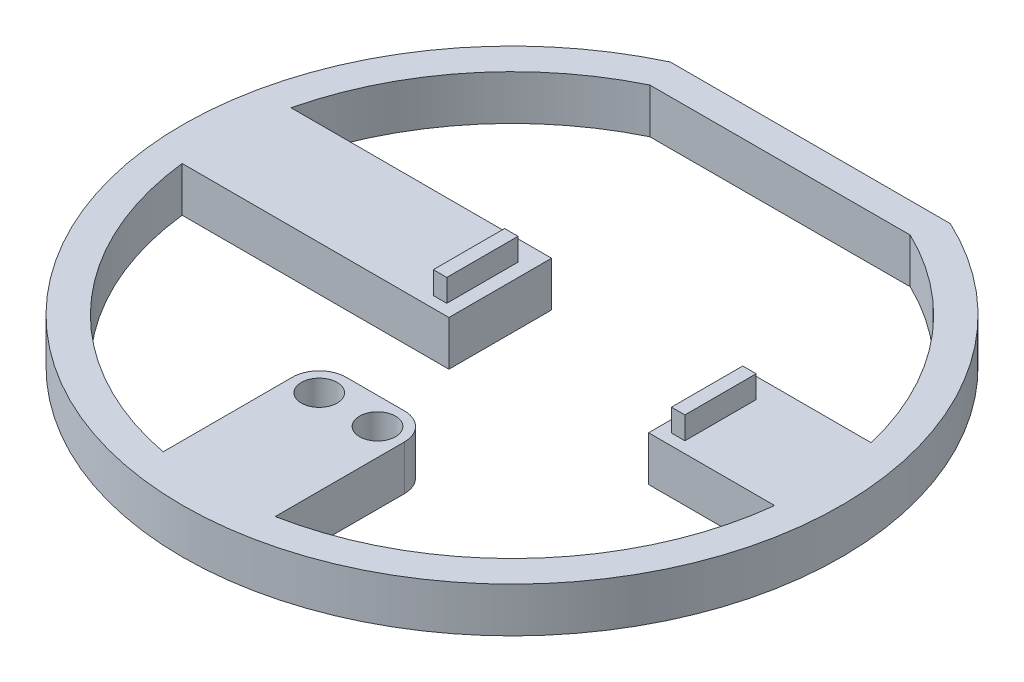
ISO-10303-21;
HEADER;
FILE_DESCRIPTION(('STEP AP214'),'2;1');
FILE_NAME('part.step','',(''),(''),'','','');
FILE_SCHEMA(('AUTOMOTIVE_DESIGN { 1 0 10303 214 1 1 1 1 }'));
ENDSEC;
DATA;
#1=APPLICATION_CONTEXT('core data for automotive mechanical design processes');
#2=APPLICATION_PROTOCOL_DEFINITION('international standard','automotive_design',2000,#1);
#3=PRODUCT_CONTEXT('',#1,'mechanical');
#4=PRODUCT('Part','Part','',(#3));
#5=PRODUCT_RELATED_PRODUCT_CATEGORY('part','',(#4));
#6=PRODUCT_DEFINITION_FORMATION('','',#4);
#7=PRODUCT_DEFINITION_CONTEXT('part definition',#1,'design');
#8=PRODUCT_DEFINITION('design','',#6,#7);
#9=PRODUCT_DEFINITION_SHAPE('','',#8);
#10=(LENGTH_UNIT() NAMED_UNIT(*) SI_UNIT(.MILLI.,.METRE.));
#11=(NAMED_UNIT(*) PLANE_ANGLE_UNIT() SI_UNIT($,.RADIAN.));
#12=(NAMED_UNIT(*) SI_UNIT($,.STERADIAN.) SOLID_ANGLE_UNIT());
#13=UNCERTAINTY_MEASURE_WITH_UNIT(LENGTH_MEASURE(1.E-05),#10,'distance_accuracy_value','');
#14=(GEOMETRIC_REPRESENTATION_CONTEXT(3) GLOBAL_UNCERTAINTY_ASSIGNED_CONTEXT((#13)) GLOBAL_UNIT_ASSIGNED_CONTEXT((#10,
#11,#12)) REPRESENTATION_CONTEXT('',''));
#15=CARTESIAN_POINT('',(0.,0.,0.));
#16=DIRECTION('',(0.,0.,1.));
#17=DIRECTION('',(1.,0.,0.));
#18=AXIS2_PLACEMENT_3D('',#15,#16,#17);
#19=CARTESIAN_POINT('',(0.0388478503475835,5.,-0.477288358163387));
#20=DIRECTION('',(0.,-1.,0.));
#21=DIRECTION('',(0.,0.,-1.));
#22=AXIS2_PLACEMENT_3D('',#19,#20,#21);
#23=PLANE('',#22);
#24=DIRECTION('',(0.,0.,-1.));
#25=VECTOR('',#24,1.);
#26=CARTESIAN_POINT('',(21.8158384167038,5.,2.02271164183556));
#27=LINE('',#26,#25);
#28=CARTESIAN_POINT('',(21.8158384167038,5.,2.02271164183556));
#29=VERTEX_POINT('',#28);
#30=CARTESIAN_POINT('',(21.8158384167038,5.,-5.92728835816445));
#31=VERTEX_POINT('',#30);
#32=EDGE_CURVE('E229',#29,#31,#27,.T.);
#33=ORIENTED_EDGE('',*,*,#32,.F.);
#34=DIRECTION('',(1.,0.,0.));
#35=VECTOR('',#34,1.);
#36=CARTESIAN_POINT('',(21.8158384167038,5.,2.02271164183556));
#37=LINE('',#36,#35);
#38=CARTESIAN_POINT('',(20.3158384167037,5.,2.02271164183556));
#39=VERTEX_POINT('',#38);
#40=EDGE_CURVE('E242',#39,#29,#37,.T.);
#41=ORIENTED_EDGE('',*,*,#40,.F.);
#42=DIRECTION('',(0.,0.,1.));
#43=VECTOR('',#42,1.);
#44=CARTESIAN_POINT('',(20.3158384167037,5.,2.02271164183556));
#45=LINE('',#44,#43);
#46=CARTESIAN_POINT('',(20.3158384167037,5.,-5.92728835816445));
#47=VERTEX_POINT('',#46);
#48=EDGE_CURVE('E251',#47,#39,#45,.T.);
#49=ORIENTED_EDGE('',*,*,#48,.F.);
#50=DIRECTION('',(-1.,0.,0.));
#51=VECTOR('',#50,1.);
#52=CARTESIAN_POINT('',(21.8158384167038,5.,-5.92728835816445));
#53=LINE('',#52,#51);
#54=EDGE_CURVE('E232',#31,#47,#53,.T.);
#55=ORIENTED_EDGE('',*,*,#54,.F.);
#56=EDGE_LOOP('',(#33,#41,#49,#55));
#57=FACE_BOUND('',#56,.T.);
#58=CARTESIAN_POINT('',(0.0388478503475835,5.,-0.477288358163387));
#59=DIRECTION('',(0.,1.,0.));
#60=DIRECTION('',(0.,0.,-1.));
#61=AXIS2_PLACEMENT_3D('',#58,#59,#60);
#62=CIRCLE('',#61,36.75);
#63=CARTESIAN_POINT('',(-15.5673165332141,5.,-33.7490501575219));
#64=VERTEX_POINT('',#63);
#65=CARTESIAN_POINT('',(15.6450122339092,5.,-33.7490501575219));
#66=VERTEX_POINT('',#65);
#67=EDGE_CURVE('E395',#64,#66,#62,.T.);
#68=ORIENTED_EDGE('',*,*,#67,.T.);
#69=DIRECTION('',(-1.,0.,0.));
#70=VECTOR('',#69,1.);
#71=CARTESIAN_POINT('',(-15.5673165332141,5.,-33.7490501575219));
#72=LINE('',#71,#70);
#73=EDGE_CURVE('E398',#66,#64,#72,.T.);
#74=ORIENTED_EDGE('',*,*,#73,.T.);
#75=EDGE_LOOP('',(#68,#74));
#76=FACE_BOUND('',#75,.T.);
#77=CARTESIAN_POINT('',(0.0388478503475835,5.,-0.477288358163387));
#78=DIRECTION('',(0.,1.,0.));
#79=DIRECTION('',(0.,0.,1.));
#80=AXIS2_PLACEMENT_3D('',#77,#78,#79);
#81=CIRCLE('',#80,33.25);
#82=CARTESIAN_POINT('',(-14.4938903446665,5.,-30.3831744101629));
#83=VERTEX_POINT('',#82);
#84=CARTESIAN_POINT('',(-32.3072879312261,5.,-8.1772883581631));
#85=VERTEX_POINT('',#84);
#86=EDGE_CURVE('E280',#83,#85,#81,.T.);
#87=ORIENTED_EDGE('',*,*,#86,.F.);
#88=DIRECTION('',(-0.999999486639258,0.,0.0010132725305394));
#89=VECTOR('',#88,1.);
#90=CARTESIAN_POINT('',(-14.4938903446665,5.,-30.3831744101629));
#91=LINE('',#90,#89);
#92=CARTESIAN_POINT('',(14.5109506086569,5.,-30.4125642338412));
#93=VERTEX_POINT('',#92);
#94=EDGE_CURVE('E312',#93,#83,#91,.T.);
#95=ORIENTED_EDGE('',*,*,#94,.F.);
#96=CARTESIAN_POINT('',(0.0388478503475835,5.,-0.477288358163387));
#97=DIRECTION('',(0.,1.,0.));
#98=DIRECTION('',(0.,0.,-1.));
#99=AXIS2_PLACEMENT_3D('',#96,#97,#98);
#100=CIRCLE('',#99,33.25);
#101=CARTESIAN_POINT('',(32.3849836319213,5.,-8.17728835816311));
#102=VERTEX_POINT('',#101);
#103=EDGE_CURVE('E309',#102,#93,#100,.T.);
#104=ORIENTED_EDGE('',*,*,#103,.F.);
#105=DIRECTION('',(1.,0.,0.));
#106=VECTOR('',#105,1.);
#107=CARTESIAN_POINT('',(19.0142370342253,5.,-8.1772883581631));
#108=LINE('',#107,#106);
#109=CARTESIAN_POINT('',(19.0142370342253,5.,-8.1772883581631));
#110=VERTEX_POINT('',#109);
#111=EDGE_CURVE('E307',#110,#102,#108,.T.);
#112=ORIENTED_EDGE('',*,*,#111,.F.);
#113=DIRECTION('',(0.,0.,-1.));
#114=VECTOR('',#113,1.);
#115=CARTESIAN_POINT('',(19.0142370342253,5.,3.27271164183657));
#116=LINE('',#115,#114);
#117=CARTESIAN_POINT('',(19.0142370342253,5.,3.27271164183657));
#118=VERTEX_POINT('',#117);
#119=EDGE_CURVE('E305',#118,#110,#116,.T.);
#120=ORIENTED_EDGE('',*,*,#119,.F.);
#121=DIRECTION('',(-1.,0.,0.));
#122=VECTOR('',#121,1.);
#123=CARTESIAN_POINT('',(19.0142370342253,5.,3.27271164183657));
#124=LINE('',#123,#122);
#125=CARTESIAN_POINT('',(33.0767049237112,5.,3.27271164183657));
#126=VERTEX_POINT('',#125);
#127=EDGE_CURVE('E303',#126,#118,#124,.T.);
#128=ORIENTED_EDGE('',*,*,#127,.F.);
#129=CARTESIAN_POINT('',(0.0388478503475835,5.,-0.477288358163387));
#130=DIRECTION('',(0.,1.,0.));
#131=DIRECTION('',(0.,0.,-1.));
#132=AXIS2_PLACEMENT_3D('',#129,#130,#131);
#133=CIRCLE('',#132,33.25);
#134=CARTESIAN_POINT('',(6.28884785034758,5.,32.1800232274525));
#135=VERTEX_POINT('',#134);
#136=EDGE_CURVE('E301',#135,#126,#133,.T.);
#137=ORIENTED_EDGE('',*,*,#136,.F.);
#138=DIRECTION('',(0.,0.,1.));
#139=VECTOR('',#138,1.);
#140=CARTESIAN_POINT('',(6.28884785034758,5.,32.1800232274525));
#141=LINE('',#140,#139);
#142=CARTESIAN_POINT('',(6.28884785034758,5.,17.772711641835));
#143=VERTEX_POINT('',#142);
#144=EDGE_CURVE('E299',#143,#135,#141,.T.);
#145=ORIENTED_EDGE('',*,*,#144,.F.);
#146=CARTESIAN_POINT('',(3.28884785034758,5.,17.772711641835));
#147=DIRECTION('',(0.,-1.,0.));
#148=DIRECTION('',(0.,0.,1.));
#149=AXIS2_PLACEMENT_3D('',#146,#147,#148);
#150=CIRCLE('',#149,3.);
#151=CARTESIAN_POINT('',(3.28884785034758,5.,14.772711641835));
#152=VERTEX_POINT('',#151);
#153=EDGE_CURVE('E297',#152,#143,#150,.T.);
#154=ORIENTED_EDGE('',*,*,#153,.F.);
#155=DIRECTION('',(1.,0.,0.));
#156=VECTOR('',#155,1.);
#157=CARTESIAN_POINT('',(-3.21115214965242,5.,14.772711641835));
#158=LINE('',#157,#156);
#159=CARTESIAN_POINT('',(-3.21115214965242,5.,14.772711641835));
#160=VERTEX_POINT('',#159);
#161=EDGE_CURVE('E295',#160,#152,#158,.T.);
#162=ORIENTED_EDGE('',*,*,#161,.F.);
#163=CARTESIAN_POINT('',(-3.21115214965242,5.,17.772711641835));
#164=DIRECTION('',(0.,-1.,0.));
#165=DIRECTION('',(0.,0.,-1.));
#166=AXIS2_PLACEMENT_3D('',#163,#164,#165);
#167=CIRCLE('',#166,3.);
#168=CARTESIAN_POINT('',(-6.21115214965242,5.,17.7727116418366));
#169=VERTEX_POINT('',#168);
#170=EDGE_CURVE('E293',#169,#160,#167,.T.);
#171=ORIENTED_EDGE('',*,*,#170,.F.);
#172=DIRECTION('',(0.,0.,-1.));
#173=VECTOR('',#172,1.);
#174=CARTESIAN_POINT('',(-6.21115214965242,5.,17.7727116418366));
#175=LINE('',#174,#173);
#176=CARTESIAN_POINT('',(-6.21115214965242,5.,32.1800232274525));
#177=VERTEX_POINT('',#176);
#178=EDGE_CURVE('E291',#177,#169,#175,.T.);
#179=ORIENTED_EDGE('',*,*,#178,.F.);
#180=CARTESIAN_POINT('',(0.0388478503475835,5.,-0.477288358163387));
#181=DIRECTION('',(0.,1.,0.));
#182=DIRECTION('',(0.,0.,1.));
#183=AXIS2_PLACEMENT_3D('',#180,#181,#182);
#184=CIRCLE('',#183,33.25);
#185=CARTESIAN_POINT('',(-32.999009223016,5.,3.27271164183657));
#186=VERTEX_POINT('',#185);
#187=EDGE_CURVE('E289',#186,#177,#184,.T.);
#188=ORIENTED_EDGE('',*,*,#187,.F.);
#189=DIRECTION('',(-1.,0.,0.));
#190=VECTOR('',#189,1.);
#191=CARTESIAN_POINT('',(-3.25,5.,3.27271164183657));
#192=LINE('',#191,#190);
#193=CARTESIAN_POINT('',(-3.25,5.,3.27271164183657));
#194=VERTEX_POINT('',#193);
#195=EDGE_CURVE('E287',#194,#186,#192,.T.);
#196=ORIENTED_EDGE('',*,*,#195,.F.);
#197=DIRECTION('',(0.,0.,1.));
#198=VECTOR('',#197,1.);
#199=CARTESIAN_POINT('',(-3.25,5.,3.27271164183657));
#200=LINE('',#199,#198);
#201=CARTESIAN_POINT('',(-3.25,5.,-8.1772883581631));
#202=VERTEX_POINT('',#201);
#203=EDGE_CURVE('E285',#202,#194,#200,.T.);
#204=ORIENTED_EDGE('',*,*,#203,.F.);
#205=DIRECTION('',(1.,0.,0.));
#206=VECTOR('',#205,1.);
#207=CARTESIAN_POINT('',(-32.3072879312261,5.,-8.1772883581631));
#208=LINE('',#207,#206);
#209=EDGE_CURVE('E282',#85,#202,#208,.T.);
#210=ORIENTED_EDGE('',*,*,#209,.F.);
#211=EDGE_LOOP('',(#87,#95,#104,#112,#120,#128,#137,#145,#154,#162,#171,#179,#188,#196,#204,#210));
#212=FACE_BOUND('',#211,.T.);
#213=CARTESIAN_POINT('',(-3.21115214965242,5.,17.772711641835));
#214=DIRECTION('',(0.,1.,0.));
#215=DIRECTION('',(0.,0.,1.));
#216=AXIS2_PLACEMENT_3D('',#213,#214,#215);
#217=CIRCLE('',#216,1.99999999999876);
#218=CARTESIAN_POINT('',(-3.21115214965242,5.,19.7727116418338));
#219=VERTEX_POINT('',#218);
#220=EDGE_CURVE('E274',#219,#219,#217,.T.);
#221=ORIENTED_EDGE('',*,*,#220,.F.);
#222=EDGE_LOOP('',(#221));
#223=FACE_BOUND('',#222,.T.);
#224=CARTESIAN_POINT('',(3.28884785034758,5.,17.772711641835));
#225=DIRECTION('',(0.,1.,0.));
#226=DIRECTION('',(0.,0.,1.));
#227=AXIS2_PLACEMENT_3D('',#224,#225,#226);
#228=CIRCLE('',#227,1.99999999999876);
#229=CARTESIAN_POINT('',(3.28884785034758,5.,19.7727116418338));
#230=VERTEX_POINT('',#229);
#231=EDGE_CURVE('E268',#230,#230,#228,.T.);
#232=ORIENTED_EDGE('',*,*,#231,.F.);
#233=EDGE_LOOP('',(#232));
#234=FACE_BOUND('',#233,.T.);
#235=DIRECTION('',(0.,0.,1.));
#236=VECTOR('',#235,1.);
#237=CARTESIAN_POINT('',(-6.23814271600757,5.,2.02271164183529));
#238=LINE('',#237,#236);
#239=CARTESIAN_POINT('',(-6.23814271600757,5.,-5.92728835816473));
#240=VERTEX_POINT('',#239);
#241=CARTESIAN_POINT('',(-6.23814271600757,5.,2.02271164183529));
#242=VERTEX_POINT('',#241);
#243=EDGE_CURVE('E228',#240,#242,#238,.T.);
#244=ORIENTED_EDGE('',*,*,#243,.F.);
#245=DIRECTION('',(-1.,0.,0.));
#246=VECTOR('',#245,1.);
#247=CARTESIAN_POINT('',(-6.23814271600757,5.,-5.92728835816473));
#248=LINE('',#247,#246);
#249=CARTESIAN_POINT('',(-4.73814271600744,5.,-5.92728835816473));
#250=VERTEX_POINT('',#249);
#251=EDGE_CURVE('E225',#250,#240,#248,.T.);
#252=ORIENTED_EDGE('',*,*,#251,.F.);
#253=DIRECTION('',(0.,0.,-1.));
#254=VECTOR('',#253,1.);
#255=CARTESIAN_POINT('',(-4.73814271600744,5.,2.02271164183529));
#256=LINE('',#255,#254);
#257=CARTESIAN_POINT('',(-4.73814271600744,5.,2.02271164183529));
#258=VERTEX_POINT('',#257);
#259=EDGE_CURVE('E55',#258,#250,#256,.T.);
#260=ORIENTED_EDGE('',*,*,#259,.F.);
#261=DIRECTION('',(1.,0.,0.));
#262=VECTOR('',#261,1.);
#263=CARTESIAN_POINT('',(-6.23814271600757,5.,2.02271164183529));
#264=LINE('',#263,#262);
#265=EDGE_CURVE('E50',#242,#258,#264,.T.);
#266=ORIENTED_EDGE('',*,*,#265,.F.);
#267=EDGE_LOOP('',(#244,#252,#260,#266));
#268=FACE_BOUND('',#267,.T.);
#269=ADVANCED_FACE('F35',(#57,#76,#212,#223,#234,#268),#23,.F.);
#270=CARTESIAN_POINT('',(0.0388478503475835,0.,-0.477288358163387));
#271=DIRECTION('',(0.,-1.,0.));
#272=DIRECTION('',(0.,0.,-1.));
#273=AXIS2_PLACEMENT_3D('',#270,#271,#272);
#274=PLANE('',#273);
#275=CARTESIAN_POINT('',(-3.21115214965242,0.,17.772711641835));
#276=DIRECTION('',(0.,1.,0.));
#277=DIRECTION('',(0.,0.,1.));
#278=AXIS2_PLACEMENT_3D('',#275,#276,#277);
#279=CIRCLE('',#278,1.99999999999876);
#280=CARTESIAN_POINT('',(-3.21115214965242,0.,19.7727116418338));
#281=VERTEX_POINT('',#280);
#282=EDGE_CURVE('E271',#281,#281,#279,.T.);
#283=ORIENTED_EDGE('',*,*,#282,.T.);
#284=EDGE_LOOP('',(#283));
#285=FACE_BOUND('',#284,.T.);
#286=CARTESIAN_POINT('',(0.0388478503475835,0.,-0.477288358163387));
#287=DIRECTION('',(0.,1.,0.));
#288=DIRECTION('',(0.,0.,-1.));
#289=AXIS2_PLACEMENT_3D('',#286,#287,#288);
#290=CIRCLE('',#289,36.75);
#291=CARTESIAN_POINT('',(-15.5673165332141,0.,-33.7490501575219));
#292=VERTEX_POINT('',#291);
#293=CARTESIAN_POINT('',(15.6450122339092,0.,-33.7490501575219));
#294=VERTEX_POINT('',#293);
#295=EDGE_CURVE('E394',#292,#294,#290,.T.);
#296=ORIENTED_EDGE('',*,*,#295,.F.);
#297=DIRECTION('',(-1.,0.,0.));
#298=VECTOR('',#297,1.);
#299=CARTESIAN_POINT('',(-15.5673165332141,0.,-33.7490501575219));
#300=LINE('',#299,#298);
#301=EDGE_CURVE('E399',#294,#292,#300,.T.);
#302=ORIENTED_EDGE('',*,*,#301,.F.);
#303=EDGE_LOOP('',(#296,#302));
#304=FACE_BOUND('',#303,.T.);
#305=DIRECTION('',(-0.999999486639258,0.,0.0010132725305394));
#306=VECTOR('',#305,1.);
#307=CARTESIAN_POINT('',(-14.4938903446665,0.,-30.3831744101629));
#308=LINE('',#307,#306);
#309=CARTESIAN_POINT('',(14.5109506086569,0.,-30.4125642338412));
#310=VERTEX_POINT('',#309);
#311=CARTESIAN_POINT('',(-14.4938903446665,0.,-30.3831744101629));
#312=VERTEX_POINT('',#311);
#313=EDGE_CURVE('E283',#310,#312,#308,.T.);
#314=ORIENTED_EDGE('',*,*,#313,.T.);
#315=CARTESIAN_POINT('',(0.0388478503475835,0.,-0.477288358163387));
#316=DIRECTION('',(0.,1.,0.));
#317=DIRECTION('',(0.,0.,1.));
#318=AXIS2_PLACEMENT_3D('',#315,#316,#317);
#319=CIRCLE('',#318,33.25);
#320=CARTESIAN_POINT('',(-32.3072879312261,0.,-8.1772883581631));
#321=VERTEX_POINT('',#320);
#322=EDGE_CURVE('E277',#312,#321,#319,.T.);
#323=ORIENTED_EDGE('',*,*,#322,.T.);
#324=DIRECTION('',(1.,0.,0.));
#325=VECTOR('',#324,1.);
#326=CARTESIAN_POINT('',(-32.3072879312261,0.,-8.1772883581631));
#327=LINE('',#326,#325);
#328=CARTESIAN_POINT('',(-3.25,0.,-8.1772883581631));
#329=VERTEX_POINT('',#328);
#330=EDGE_CURVE('E317',#321,#329,#327,.T.);
#331=ORIENTED_EDGE('',*,*,#330,.T.);
#332=DIRECTION('',(0.,0.,1.));
#333=VECTOR('',#332,1.);
#334=CARTESIAN_POINT('',(-3.25,0.,3.27271164183657));
#335=LINE('',#334,#333);
#336=CARTESIAN_POINT('',(-3.25,0.,3.27271164183657));
#337=VERTEX_POINT('',#336);
#338=EDGE_CURVE('E320',#329,#337,#335,.T.);
#339=ORIENTED_EDGE('',*,*,#338,.T.);
#340=DIRECTION('',(-1.,0.,0.));
#341=VECTOR('',#340,1.);
#342=CARTESIAN_POINT('',(-3.25,0.,3.27271164183657));
#343=LINE('',#342,#341);
#344=CARTESIAN_POINT('',(-32.999009223016,0.,3.27271164183657));
#345=VERTEX_POINT('',#344);
#346=EDGE_CURVE('E323',#337,#345,#343,.T.);
#347=ORIENTED_EDGE('',*,*,#346,.T.);
#348=CARTESIAN_POINT('',(0.0388478503475835,0.,-0.477288358163387));
#349=DIRECTION('',(0.,1.,0.));
#350=DIRECTION('',(0.,0.,1.));
#351=AXIS2_PLACEMENT_3D('',#348,#349,#350);
#352=CIRCLE('',#351,33.25);
#353=CARTESIAN_POINT('',(-6.21115214965242,0.,32.1800232274525));
#354=VERTEX_POINT('',#353);
#355=EDGE_CURVE('E326',#345,#354,#352,.T.);
#356=ORIENTED_EDGE('',*,*,#355,.T.);
#357=DIRECTION('',(0.,0.,-1.));
#358=VECTOR('',#357,1.);
#359=CARTESIAN_POINT('',(-6.21115214965242,0.,17.7727116418366));
#360=LINE('',#359,#358);
#361=CARTESIAN_POINT('',(-6.21115214965242,0.,17.7727116418366));
#362=VERTEX_POINT('',#361);
#363=EDGE_CURVE('E329',#354,#362,#360,.T.);
#364=ORIENTED_EDGE('',*,*,#363,.T.);
#365=CARTESIAN_POINT('',(-3.21115214965242,0.,17.772711641835));
#366=DIRECTION('',(0.,-1.,0.));
#367=DIRECTION('',(0.,0.,-1.));
#368=AXIS2_PLACEMENT_3D('',#365,#366,#367);
#369=CIRCLE('',#368,3.);
#370=CARTESIAN_POINT('',(-3.21115214965242,0.,14.772711641835));
#371=VERTEX_POINT('',#370);
#372=EDGE_CURVE('E332',#362,#371,#369,.T.);
#373=ORIENTED_EDGE('',*,*,#372,.T.);
#374=DIRECTION('',(1.,0.,0.));
#375=VECTOR('',#374,1.);
#376=CARTESIAN_POINT('',(-3.21115214965242,0.,14.772711641835));
#377=LINE('',#376,#375);
#378=CARTESIAN_POINT('',(3.28884785034758,0.,14.772711641835));
#379=VERTEX_POINT('',#378);
#380=EDGE_CURVE('E335',#371,#379,#377,.T.);
#381=ORIENTED_EDGE('',*,*,#380,.T.);
#382=CARTESIAN_POINT('',(3.28884785034758,0.,17.772711641835));
#383=DIRECTION('',(0.,-1.,0.));
#384=DIRECTION('',(0.,0.,1.));
#385=AXIS2_PLACEMENT_3D('',#382,#383,#384);
#386=CIRCLE('',#385,3.);
#387=CARTESIAN_POINT('',(6.28884785034758,0.,17.772711641835));
#388=VERTEX_POINT('',#387);
#389=EDGE_CURVE('E338',#379,#388,#386,.T.);
#390=ORIENTED_EDGE('',*,*,#389,.T.);
#391=DIRECTION('',(0.,0.,1.));
#392=VECTOR('',#391,1.);
#393=CARTESIAN_POINT('',(6.28884785034758,0.,32.1800232274525));
#394=LINE('',#393,#392);
#395=CARTESIAN_POINT('',(6.28884785034758,0.,32.1800232274525));
#396=VERTEX_POINT('',#395);
#397=EDGE_CURVE('E341',#388,#396,#394,.T.);
#398=ORIENTED_EDGE('',*,*,#397,.T.);
#399=CARTESIAN_POINT('',(0.0388478503475835,0.,-0.477288358163387));
#400=DIRECTION('',(0.,1.,0.));
#401=DIRECTION('',(0.,0.,-1.));
#402=AXIS2_PLACEMENT_3D('',#399,#400,#401);
#403=CIRCLE('',#402,33.25);
#404=CARTESIAN_POINT('',(33.0767049237112,0.,3.27271164183657));
#405=VERTEX_POINT('',#404);
#406=EDGE_CURVE('E344',#396,#405,#403,.T.);
#407=ORIENTED_EDGE('',*,*,#406,.T.);
#408=DIRECTION('',(-1.,0.,0.));
#409=VECTOR('',#408,1.);
#410=CARTESIAN_POINT('',(19.0142370342253,0.,3.27271164183657));
#411=LINE('',#410,#409);
#412=CARTESIAN_POINT('',(19.0142370342253,0.,3.27271164183657));
#413=VERTEX_POINT('',#412);
#414=EDGE_CURVE('E347',#405,#413,#411,.T.);
#415=ORIENTED_EDGE('',*,*,#414,.T.);
#416=DIRECTION('',(0.,0.,-1.));
#417=VECTOR('',#416,1.);
#418=CARTESIAN_POINT('',(19.0142370342253,0.,3.27271164183657));
#419=LINE('',#418,#417);
#420=CARTESIAN_POINT('',(19.0142370342253,0.,-8.1772883581631));
#421=VERTEX_POINT('',#420);
#422=EDGE_CURVE('E350',#413,#421,#419,.T.);
#423=ORIENTED_EDGE('',*,*,#422,.T.);
#424=DIRECTION('',(1.,0.,0.));
#425=VECTOR('',#424,1.);
#426=CARTESIAN_POINT('',(19.0142370342253,0.,-8.1772883581631));
#427=LINE('',#426,#425);
#428=CARTESIAN_POINT('',(32.3849836319213,0.,-8.17728835816311));
#429=VERTEX_POINT('',#428);
#430=EDGE_CURVE('E353',#421,#429,#427,.T.);
#431=ORIENTED_EDGE('',*,*,#430,.T.);
#432=CARTESIAN_POINT('',(0.0388478503475835,0.,-0.477288358163387));
#433=DIRECTION('',(0.,1.,0.));
#434=DIRECTION('',(0.,0.,-1.));
#435=AXIS2_PLACEMENT_3D('',#432,#433,#434);
#436=CIRCLE('',#435,33.25);
#437=EDGE_CURVE('E356',#429,#310,#436,.T.);
#438=ORIENTED_EDGE('',*,*,#437,.T.);
#439=EDGE_LOOP('',(#314,#323,#331,#339,#347,#356,#364,#373,#381,#390,#398,#407,#415,#423,#431,#438));
#440=FACE_BOUND('',#439,.T.);
#441=CARTESIAN_POINT('',(3.28884785034758,0.,17.772711641835));
#442=DIRECTION('',(0.,1.,0.));
#443=DIRECTION('',(0.,0.,1.));
#444=AXIS2_PLACEMENT_3D('',#441,#442,#443);
#445=CIRCLE('',#444,1.99999999999876);
#446=CARTESIAN_POINT('',(3.28884785034758,0.,19.7727116418338));
#447=VERTEX_POINT('',#446);
#448=EDGE_CURVE('E267',#447,#447,#445,.T.);
#449=ORIENTED_EDGE('',*,*,#448,.T.);
#450=EDGE_LOOP('',(#449));
#451=FACE_BOUND('',#450,.T.);
#452=ADVANCED_FACE('F411',(#285,#304,#440,#451),#274,.T.);
#453=CARTESIAN_POINT('',(0.0388478503475835,5.,-0.477288358163387));
#454=DIRECTION('',(0.,-1.,0.));
#455=DIRECTION('',(0.,0.,-1.));
#456=AXIS2_PLACEMENT_3D('',#453,#454,#455);
#457=CYLINDRICAL_SURFACE('',#456,36.75);
#458=ORIENTED_EDGE('',*,*,#295,.T.);
#459=DIRECTION('',(0.,-1.,0.));
#460=VECTOR('',#459,1.);
#461=CARTESIAN_POINT('',(15.6450122339092,5.,-33.7490501575219));
#462=LINE('',#461,#460);
#463=EDGE_CURVE('E11',#66,#294,#462,.T.);
#464=ORIENTED_EDGE('',*,*,#463,.F.);
#465=ORIENTED_EDGE('',*,*,#67,.F.);
#466=DIRECTION('',(0.,-1.,0.));
#467=VECTOR('',#466,1.);
#468=CARTESIAN_POINT('',(-15.5673165332141,5.,-33.7490501575219));
#469=LINE('',#468,#467);
#470=EDGE_CURVE('E43',#64,#292,#469,.T.);
#471=ORIENTED_EDGE('',*,*,#470,.T.);
#472=EDGE_LOOP('',(#458,#464,#465,#471));
#473=FACE_BOUND('',#472,.T.);
#474=ADVANCED_FACE('F37',(#473),#457,.T.);
#475=CARTESIAN_POINT('',(-15.5673165332141,5.,-33.7490501575219));
#476=DIRECTION('',(0.,0.,1.));
#477=DIRECTION('',(1.,0.,0.));
#478=AXIS2_PLACEMENT_3D('',#475,#476,#477);
#479=PLANE('',#478);
#480=ORIENTED_EDGE('',*,*,#301,.T.);
#481=ORIENTED_EDGE('',*,*,#470,.F.);
#482=ORIENTED_EDGE('',*,*,#73,.F.);
#483=ORIENTED_EDGE('',*,*,#463,.T.);
#484=EDGE_LOOP('',(#480,#481,#482,#483));
#485=FACE_BOUND('',#484,.T.);
#486=ADVANCED_FACE('F413',(#485),#479,.F.);
#487=CARTESIAN_POINT('',(0.0388478503475835,5.,-0.477288358163387));
#488=DIRECTION('',(0.,-1.,0.));
#489=DIRECTION('',(0.,0.,-1.));
#490=AXIS2_PLACEMENT_3D('',#487,#488,#489);
#491=CYLINDRICAL_SURFACE('',#490,33.25);
#492=ORIENTED_EDGE('',*,*,#322,.F.);
#493=DIRECTION('',(0.,-1.,0.));
#494=VECTOR('',#493,1.);
#495=CARTESIAN_POINT('',(-14.4938903446665,5.,-30.3831744101629));
#496=LINE('',#495,#494);
#497=EDGE_CURVE('E314',#83,#312,#496,.T.);
#498=ORIENTED_EDGE('',*,*,#497,.F.);
#499=ORIENTED_EDGE('',*,*,#86,.T.);
#500=DIRECTION('',(0.,-1.,0.));
#501=VECTOR('',#500,1.);
#502=CARTESIAN_POINT('',(-32.3072879312261,5.,-8.1772883581631));
#503=LINE('',#502,#501);
#504=EDGE_CURVE('E391',#85,#321,#503,.T.);
#505=ORIENTED_EDGE('',*,*,#504,.T.);
#506=EDGE_LOOP('',(#492,#498,#499,#505));
#507=FACE_BOUND('',#506,.T.);
#508=ADVANCED_FACE('F540',(#507),#491,.F.);
#509=CARTESIAN_POINT('',(-32.3072879312261,5.,-8.1772883581631));
#510=DIRECTION('',(0.,0.,-1.));
#511=DIRECTION('',(-1.,0.,0.));
#512=AXIS2_PLACEMENT_3D('',#509,#510,#511);
#513=PLANE('',#512);
#514=ORIENTED_EDGE('',*,*,#330,.F.);
#515=ORIENTED_EDGE('',*,*,#504,.F.);
#516=ORIENTED_EDGE('',*,*,#209,.T.);
#517=DIRECTION('',(0.,-1.,0.));
#518=VECTOR('',#517,1.);
#519=CARTESIAN_POINT('',(-3.25,5.,-8.1772883581631));
#520=LINE('',#519,#518);
#521=EDGE_CURVE('E389',#202,#329,#520,.T.);
#522=ORIENTED_EDGE('',*,*,#521,.T.);
#523=EDGE_LOOP('',(#514,#515,#516,#522));
#524=FACE_BOUND('',#523,.T.);
#525=ADVANCED_FACE('F536',(#524),#513,.T.);
#526=CARTESIAN_POINT('',(-3.25,5.,3.27271164183657));
#527=DIRECTION('',(1.,0.,0.));
#528=DIRECTION('',(0.,0.,-1.));
#529=AXIS2_PLACEMENT_3D('',#526,#527,#528);
#530=PLANE('',#529);
#531=ORIENTED_EDGE('',*,*,#338,.F.);
#532=ORIENTED_EDGE('',*,*,#521,.F.);
#533=ORIENTED_EDGE('',*,*,#203,.T.);
#534=DIRECTION('',(0.,-1.,0.));
#535=VECTOR('',#534,1.);
#536=CARTESIAN_POINT('',(-3.25,5.,3.27271164183657));
#537=LINE('',#536,#535);
#538=EDGE_CURVE('E387',#194,#337,#537,.T.);
#539=ORIENTED_EDGE('',*,*,#538,.T.);
#540=EDGE_LOOP('',(#531,#532,#533,#539));
#541=FACE_BOUND('',#540,.T.);
#542=ADVANCED_FACE('F532',(#541),#530,.T.);
#543=CARTESIAN_POINT('',(-3.25,5.,3.27271164183657));
#544=DIRECTION('',(0.,0.,1.));
#545=DIRECTION('',(1.,0.,0.));
#546=AXIS2_PLACEMENT_3D('',#543,#544,#545);
#547=PLANE('',#546);
#548=ORIENTED_EDGE('',*,*,#346,.F.);
#549=ORIENTED_EDGE('',*,*,#538,.F.);
#550=ORIENTED_EDGE('',*,*,#195,.T.);
#551=DIRECTION('',(0.,-1.,0.));
#552=VECTOR('',#551,1.);
#553=CARTESIAN_POINT('',(-32.999009223016,5.,3.27271164183657));
#554=LINE('',#553,#552);
#555=EDGE_CURVE('E385',#186,#345,#554,.T.);
#556=ORIENTED_EDGE('',*,*,#555,.T.);
#557=EDGE_LOOP('',(#548,#549,#550,#556));
#558=FACE_BOUND('',#557,.T.);
#559=ADVANCED_FACE('F528',(#558),#547,.T.);
#560=CARTESIAN_POINT('',(0.0388478503475835,5.,-0.477288358163387));
#561=DIRECTION('',(0.,-1.,0.));
#562=DIRECTION('',(0.,0.,-1.));
#563=AXIS2_PLACEMENT_3D('',#560,#561,#562);
#564=CYLINDRICAL_SURFACE('',#563,33.25);
#565=ORIENTED_EDGE('',*,*,#355,.F.);
#566=ORIENTED_EDGE('',*,*,#555,.F.);
#567=ORIENTED_EDGE('',*,*,#187,.T.);
#568=DIRECTION('',(0.,-1.,0.));
#569=VECTOR('',#568,1.);
#570=CARTESIAN_POINT('',(-6.21115214965242,5.,32.1800232274525));
#571=LINE('',#570,#569);
#572=EDGE_CURVE('E383',#177,#354,#571,.T.);
#573=ORIENTED_EDGE('',*,*,#572,.T.);
#574=EDGE_LOOP('',(#565,#566,#567,#573));
#575=FACE_BOUND('',#574,.T.);
#576=ADVANCED_FACE('F524',(#575),#564,.F.);
#577=CARTESIAN_POINT('',(-6.21115214965242,5.,17.7727116418366));
#578=DIRECTION('',(-1.,0.,0.));
#579=DIRECTION('',(0.,0.,1.));
#580=AXIS2_PLACEMENT_3D('',#577,#578,#579);
#581=PLANE('',#580);
#582=ORIENTED_EDGE('',*,*,#363,.F.);
#583=ORIENTED_EDGE('',*,*,#572,.F.);
#584=ORIENTED_EDGE('',*,*,#178,.T.);
#585=DIRECTION('',(0.,-1.,0.));
#586=VECTOR('',#585,1.);
#587=CARTESIAN_POINT('',(-6.21115214965242,5.,17.7727116418366));
#588=LINE('',#587,#586);
#589=EDGE_CURVE('E381',#169,#362,#588,.T.);
#590=ORIENTED_EDGE('',*,*,#589,.T.);
#591=EDGE_LOOP('',(#582,#583,#584,#590));
#592=FACE_BOUND('',#591,.T.);
#593=ADVANCED_FACE('F520',(#592),#581,.T.);
#594=CARTESIAN_POINT('',(-3.21115214965242,5.,17.772711641835));
#595=DIRECTION('',(0.,-1.,0.));
#596=DIRECTION('',(0.,0.,-1.));
#597=AXIS2_PLACEMENT_3D('',#594,#595,#596);
#598=CYLINDRICAL_SURFACE('',#597,3.);
#599=ORIENTED_EDGE('',*,*,#372,.F.);
#600=ORIENTED_EDGE('',*,*,#589,.F.);
#601=ORIENTED_EDGE('',*,*,#170,.T.);
#602=DIRECTION('',(0.,-1.,0.));
#603=VECTOR('',#602,1.);
#604=CARTESIAN_POINT('',(-3.21115214965242,5.,14.772711641835));
#605=LINE('',#604,#603);
#606=EDGE_CURVE('E379',#160,#371,#605,.T.);
#607=ORIENTED_EDGE('',*,*,#606,.T.);
#608=EDGE_LOOP('',(#599,#600,#601,#607));
#609=FACE_BOUND('',#608,.T.);
#610=ADVANCED_FACE('F516',(#609),#598,.T.);
#611=CARTESIAN_POINT('',(-3.21115214965242,5.,14.772711641835));
#612=DIRECTION('',(0.,0.,-1.));
#613=DIRECTION('',(-1.,0.,0.));
#614=AXIS2_PLACEMENT_3D('',#611,#612,#613);
#615=PLANE('',#614);
#616=ORIENTED_EDGE('',*,*,#380,.F.);
#617=ORIENTED_EDGE('',*,*,#606,.F.);
#618=ORIENTED_EDGE('',*,*,#161,.T.);
#619=DIRECTION('',(0.,-1.,0.));
#620=VECTOR('',#619,1.);
#621=CARTESIAN_POINT('',(3.28884785034758,5.,14.772711641835));
#622=LINE('',#621,#620);
#623=EDGE_CURVE('E377',#152,#379,#622,.T.);
#624=ORIENTED_EDGE('',*,*,#623,.T.);
#625=EDGE_LOOP('',(#616,#617,#618,#624));
#626=FACE_BOUND('',#625,.T.);
#627=ADVANCED_FACE('F512',(#626),#615,.T.);
#628=CARTESIAN_POINT('',(3.28884785034758,5.,17.772711641835));
#629=DIRECTION('',(0.,-1.,0.));
#630=DIRECTION('',(0.,0.,-1.));
#631=AXIS2_PLACEMENT_3D('',#628,#629,#630);
#632=CYLINDRICAL_SURFACE('',#631,3.);
#633=ORIENTED_EDGE('',*,*,#389,.F.);
#634=ORIENTED_EDGE('',*,*,#623,.F.);
#635=ORIENTED_EDGE('',*,*,#153,.T.);
#636=DIRECTION('',(0.,-1.,0.));
#637=VECTOR('',#636,1.);
#638=CARTESIAN_POINT('',(6.28884785034758,5.,17.772711641835));
#639=LINE('',#638,#637);
#640=EDGE_CURVE('E375',#143,#388,#639,.T.);
#641=ORIENTED_EDGE('',*,*,#640,.T.);
#642=EDGE_LOOP('',(#633,#634,#635,#641));
#643=FACE_BOUND('',#642,.T.);
#644=ADVANCED_FACE('F508',(#643),#632,.T.);
#645=CARTESIAN_POINT('',(6.28884785034758,5.,32.1800232274525));
#646=DIRECTION('',(1.,0.,0.));
#647=DIRECTION('',(0.,0.,-1.));
#648=AXIS2_PLACEMENT_3D('',#645,#646,#647);
#649=PLANE('',#648);
#650=ORIENTED_EDGE('',*,*,#397,.F.);
#651=ORIENTED_EDGE('',*,*,#640,.F.);
#652=ORIENTED_EDGE('',*,*,#144,.T.);
#653=DIRECTION('',(0.,-1.,0.));
#654=VECTOR('',#653,1.);
#655=CARTESIAN_POINT('',(6.28884785034758,5.,32.1800232274525));
#656=LINE('',#655,#654);
#657=EDGE_CURVE('E373',#135,#396,#656,.T.);
#658=ORIENTED_EDGE('',*,*,#657,.T.);
#659=EDGE_LOOP('',(#650,#651,#652,#658));
#660=FACE_BOUND('',#659,.T.);
#661=ADVANCED_FACE('F504',(#660),#649,.T.);
#662=CARTESIAN_POINT('',(0.0388478503475835,5.,-0.477288358163387));
#663=DIRECTION('',(0.,-1.,0.));
#664=DIRECTION('',(0.,0.,-1.));
#665=AXIS2_PLACEMENT_3D('',#662,#663,#664);
#666=CYLINDRICAL_SURFACE('',#665,33.25);
#667=ORIENTED_EDGE('',*,*,#406,.F.);
#668=ORIENTED_EDGE('',*,*,#657,.F.);
#669=ORIENTED_EDGE('',*,*,#136,.T.);
#670=DIRECTION('',(0.,-1.,0.));
#671=VECTOR('',#670,1.);
#672=CARTESIAN_POINT('',(33.0767049237112,5.,3.27271164183657));
#673=LINE('',#672,#671);
#674=EDGE_CURVE('E371',#126,#405,#673,.T.);
#675=ORIENTED_EDGE('',*,*,#674,.T.);
#676=EDGE_LOOP('',(#667,#668,#669,#675));
#677=FACE_BOUND('',#676,.T.);
#678=ADVANCED_FACE('F500',(#677),#666,.F.);
#679=CARTESIAN_POINT('',(19.0142370342253,5.,3.27271164183657));
#680=DIRECTION('',(0.,0.,1.));
#681=DIRECTION('',(1.,0.,0.));
#682=AXIS2_PLACEMENT_3D('',#679,#680,#681);
#683=PLANE('',#682);
#684=ORIENTED_EDGE('',*,*,#414,.F.);
#685=ORIENTED_EDGE('',*,*,#674,.F.);
#686=ORIENTED_EDGE('',*,*,#127,.T.);
#687=DIRECTION('',(0.,-1.,0.));
#688=VECTOR('',#687,1.);
#689=CARTESIAN_POINT('',(19.0142370342253,5.,3.27271164183657));
#690=LINE('',#689,#688);
#691=EDGE_CURVE('E369',#118,#413,#690,.T.);
#692=ORIENTED_EDGE('',*,*,#691,.T.);
#693=EDGE_LOOP('',(#684,#685,#686,#692));
#694=FACE_BOUND('',#693,.T.);
#695=ADVANCED_FACE('F496',(#694),#683,.T.);
#696=CARTESIAN_POINT('',(19.0142370342253,5.,3.27271164183657));
#697=DIRECTION('',(-1.,0.,0.));
#698=DIRECTION('',(0.,0.,1.));
#699=AXIS2_PLACEMENT_3D('',#696,#697,#698);
#700=PLANE('',#699);
#701=ORIENTED_EDGE('',*,*,#422,.F.);
#702=ORIENTED_EDGE('',*,*,#691,.F.);
#703=ORIENTED_EDGE('',*,*,#119,.T.);
#704=DIRECTION('',(0.,-1.,0.));
#705=VECTOR('',#704,1.);
#706=CARTESIAN_POINT('',(19.0142370342253,5.,-8.1772883581631));
#707=LINE('',#706,#705);
#708=EDGE_CURVE('E367',#110,#421,#707,.T.);
#709=ORIENTED_EDGE('',*,*,#708,.T.);
#710=EDGE_LOOP('',(#701,#702,#703,#709));
#711=FACE_BOUND('',#710,.T.);
#712=ADVANCED_FACE('F492',(#711),#700,.T.);
#713=CARTESIAN_POINT('',(19.0142370342253,5.,-8.1772883581631));
#714=DIRECTION('',(0.,0.,-1.));
#715=DIRECTION('',(-1.,0.,0.));
#716=AXIS2_PLACEMENT_3D('',#713,#714,#715);
#717=PLANE('',#716);
#718=ORIENTED_EDGE('',*,*,#430,.F.);
#719=ORIENTED_EDGE('',*,*,#708,.F.);
#720=ORIENTED_EDGE('',*,*,#111,.T.);
#721=DIRECTION('',(0.,-1.,0.));
#722=VECTOR('',#721,1.);
#723=CARTESIAN_POINT('',(32.3849836319213,5.,-8.17728835816311));
#724=LINE('',#723,#722);
#725=EDGE_CURVE('E365',#102,#429,#724,.T.);
#726=ORIENTED_EDGE('',*,*,#725,.T.);
#727=EDGE_LOOP('',(#718,#719,#720,#726));
#728=FACE_BOUND('',#727,.T.);
#729=ADVANCED_FACE('F488',(#728),#717,.T.);
#730=CARTESIAN_POINT('',(0.0388478503475835,5.,-0.477288358163387));
#731=DIRECTION('',(0.,-1.,0.));
#732=DIRECTION('',(0.,0.,-1.));
#733=AXIS2_PLACEMENT_3D('',#730,#731,#732);
#734=CYLINDRICAL_SURFACE('',#733,33.25);
#735=ORIENTED_EDGE('',*,*,#437,.F.);
#736=ORIENTED_EDGE('',*,*,#725,.F.);
#737=ORIENTED_EDGE('',*,*,#103,.T.);
#738=DIRECTION('',(0.,-1.,0.));
#739=VECTOR('',#738,1.);
#740=CARTESIAN_POINT('',(14.5109506086569,5.,-30.4125642338412));
#741=LINE('',#740,#739);
#742=EDGE_CURVE('E363',#93,#310,#741,.T.);
#743=ORIENTED_EDGE('',*,*,#742,.T.);
#744=EDGE_LOOP('',(#735,#736,#737,#743));
#745=FACE_BOUND('',#744,.T.);
#746=ADVANCED_FACE('F484',(#745),#734,.F.);
#747=CARTESIAN_POINT('',(-14.4938903446665,5.,-30.3831744101629));
#748=DIRECTION('',(0.0010132725305394,0.,0.999999486639258));
#749=DIRECTION('',(0.999999486639258,0.,-0.0010132725305394));
#750=AXIS2_PLACEMENT_3D('',#747,#748,#749);
#751=PLANE('',#750);
#752=ORIENTED_EDGE('',*,*,#313,.F.);
#753=ORIENTED_EDGE('',*,*,#742,.F.);
#754=ORIENTED_EDGE('',*,*,#94,.T.);
#755=ORIENTED_EDGE('',*,*,#497,.T.);
#756=EDGE_LOOP('',(#752,#753,#754,#755));
#757=FACE_BOUND('',#756,.T.);
#758=ADVANCED_FACE('F480',(#757),#751,.T.);
#759=CARTESIAN_POINT('',(-3.21115214965242,5.,17.772711641835));
#760=DIRECTION('',(0.,-1.,0.));
#761=DIRECTION('',(0.,0.,-1.));
#762=AXIS2_PLACEMENT_3D('',#759,#760,#761);
#763=CYLINDRICAL_SURFACE('',#762,1.99999999999876);
#764=ORIENTED_EDGE('',*,*,#220,.T.);
#765=EDGE_LOOP('',(#764));
#766=FACE_BOUND('',#765,.T.);
#767=ORIENTED_EDGE('',*,*,#282,.F.);
#768=EDGE_LOOP('',(#767));
#769=FACE_BOUND('',#768,.T.);
#770=ADVANCED_FACE('F476',(#766,#769),#763,.F.);
#771=CARTESIAN_POINT('',(3.28884785034758,5.,17.772711641835));
#772=DIRECTION('',(0.,-1.,0.));
#773=DIRECTION('',(0.,0.,-1.));
#774=AXIS2_PLACEMENT_3D('',#771,#772,#773);
#775=CYLINDRICAL_SURFACE('',#774,1.99999999999876);
#776=ORIENTED_EDGE('',*,*,#231,.T.);
#777=EDGE_LOOP('',(#776));
#778=FACE_BOUND('',#777,.T.);
#779=ORIENTED_EDGE('',*,*,#448,.F.);
#780=EDGE_LOOP('',(#779));
#781=FACE_BOUND('',#780,.T.);
#782=ADVANCED_FACE('F472',(#778,#781),#775,.F.);
#783=CARTESIAN_POINT('',(21.8158384167038,7.5,2.02271164183556));
#784=DIRECTION('',(-1.,0.,0.));
#785=DIRECTION('',(0.,0.,1.));
#786=AXIS2_PLACEMENT_3D('',#783,#784,#785);
#787=PLANE('',#786);
#788=ORIENTED_EDGE('',*,*,#32,.T.);
#789=DIRECTION('',(0.,-1.,0.));
#790=VECTOR('',#789,1.);
#791=CARTESIAN_POINT('',(21.8158384167038,7.5,-5.92728835816445));
#792=LINE('',#791,#790);
#793=CARTESIAN_POINT('',(21.8158384167038,7.5,-5.92728835816445));
#794=VERTEX_POINT('',#793);
#795=EDGE_CURVE('E264',#794,#31,#792,.T.);
#796=ORIENTED_EDGE('',*,*,#795,.F.);
#797=DIRECTION('',(0.,0.,-1.));
#798=VECTOR('',#797,1.);
#799=CARTESIAN_POINT('',(21.8158384167038,7.5,2.02271164183556));
#800=LINE('',#799,#798);
#801=CARTESIAN_POINT('',(21.8158384167038,7.5,2.02271164183556));
#802=VERTEX_POINT('',#801);
#803=EDGE_CURVE('E238',#802,#794,#800,.T.);
#804=ORIENTED_EDGE('',*,*,#803,.F.);
#805=DIRECTION('',(0.,-1.,0.));
#806=VECTOR('',#805,1.);
#807=CARTESIAN_POINT('',(21.8158384167038,7.5,2.02271164183556));
#808=LINE('',#807,#806);
#809=EDGE_CURVE('E247',#802,#29,#808,.T.);
#810=ORIENTED_EDGE('',*,*,#809,.T.);
#811=EDGE_LOOP('',(#788,#796,#804,#810));
#812=FACE_BOUND('',#811,.T.);
#813=ADVANCED_FACE('F468',(#812),#787,.F.);
#814=CARTESIAN_POINT('',(21.8158384167038,7.5,-5.92728835816445));
#815=DIRECTION('',(0.,0.,1.));
#816=DIRECTION('',(1.,0.,0.));
#817=AXIS2_PLACEMENT_3D('',#814,#815,#816);
#818=PLANE('',#817);
#819=ORIENTED_EDGE('',*,*,#54,.T.);
#820=DIRECTION('',(0.,-1.,0.));
#821=VECTOR('',#820,1.);
#822=CARTESIAN_POINT('',(20.3158384167037,7.5,-5.92728835816445));
#823=LINE('',#822,#821);
#824=CARTESIAN_POINT('',(20.3158384167037,7.5,-5.92728835816445));
#825=VERTEX_POINT('',#824);
#826=EDGE_CURVE('E261',#825,#47,#823,.T.);
#827=ORIENTED_EDGE('',*,*,#826,.F.);
#828=DIRECTION('',(-1.,0.,0.));
#829=VECTOR('',#828,1.);
#830=CARTESIAN_POINT('',(21.8158384167038,7.5,-5.92728835816445));
#831=LINE('',#830,#829);
#832=EDGE_CURVE('E241',#794,#825,#831,.T.);
#833=ORIENTED_EDGE('',*,*,#832,.F.);
#834=ORIENTED_EDGE('',*,*,#795,.T.);
#835=EDGE_LOOP('',(#819,#827,#833,#834));
#836=FACE_BOUND('',#835,.T.);
#837=ADVANCED_FACE('F464',(#836),#818,.F.);
#838=CARTESIAN_POINT('',(20.3158384167037,7.5,2.02271164183556));
#839=DIRECTION('',(1.,0.,0.));
#840=DIRECTION('',(0.,0.,-1.));
#841=AXIS2_PLACEMENT_3D('',#838,#839,#840);
#842=PLANE('',#841);
#843=ORIENTED_EDGE('',*,*,#48,.T.);
#844=DIRECTION('',(0.,-1.,0.));
#845=VECTOR('',#844,1.);
#846=CARTESIAN_POINT('',(20.3158384167037,7.5,2.02271164183556));
#847=LINE('',#846,#845);
#848=CARTESIAN_POINT('',(20.3158384167037,7.5,2.02271164183556));
#849=VERTEX_POINT('',#848);
#850=EDGE_CURVE('E258',#849,#39,#847,.T.);
#851=ORIENTED_EDGE('',*,*,#850,.F.);
#852=DIRECTION('',(0.,0.,1.));
#853=VECTOR('',#852,1.);
#854=CARTESIAN_POINT('',(20.3158384167037,7.5,2.02271164183556));
#855=LINE('',#854,#853);
#856=EDGE_CURVE('E244',#825,#849,#855,.T.);
#857=ORIENTED_EDGE('',*,*,#856,.F.);
#858=ORIENTED_EDGE('',*,*,#826,.T.);
#859=EDGE_LOOP('',(#843,#851,#857,#858));
#860=FACE_BOUND('',#859,.T.);
#861=ADVANCED_FACE('F460',(#860),#842,.F.);
#862=CARTESIAN_POINT('',(21.8158384167038,7.5,2.02271164183556));
#863=DIRECTION('',(0.,0.,-1.));
#864=DIRECTION('',(-1.,0.,0.));
#865=AXIS2_PLACEMENT_3D('',#862,#863,#864);
#866=PLANE('',#865);
#867=ORIENTED_EDGE('',*,*,#40,.T.);
#868=ORIENTED_EDGE('',*,*,#809,.F.);
#869=DIRECTION('',(1.,0.,0.));
#870=VECTOR('',#869,1.);
#871=CARTESIAN_POINT('',(21.8158384167038,7.5,2.02271164183556));
#872=LINE('',#871,#870);
#873=EDGE_CURVE('E246',#849,#802,#872,.T.);
#874=ORIENTED_EDGE('',*,*,#873,.F.);
#875=ORIENTED_EDGE('',*,*,#850,.T.);
#876=EDGE_LOOP('',(#867,#868,#874,#875));
#877=FACE_BOUND('',#876,.T.);
#878=ADVANCED_FACE('F456',(#877),#866,.F.);
#879=CARTESIAN_POINT('',(0.,7.5,0.));
#880=DIRECTION('',(0.,1.,0.));
#881=DIRECTION('',(0.,0.,1.));
#882=AXIS2_PLACEMENT_3D('',#879,#880,#881);
#883=PLANE('',#882);
#884=ORIENTED_EDGE('',*,*,#803,.T.);
#885=ORIENTED_EDGE('',*,*,#832,.T.);
#886=ORIENTED_EDGE('',*,*,#856,.T.);
#887=ORIENTED_EDGE('',*,*,#873,.T.);
#888=EDGE_LOOP('',(#884,#885,#886,#887));
#889=FACE_BOUND('',#888,.T.);
#890=ADVANCED_FACE('F453',(#889),#883,.T.);
#891=CARTESIAN_POINT('',(-6.23814271600757,7.5,2.02271164183529));
#892=DIRECTION('',(1.,0.,0.));
#893=DIRECTION('',(0.,0.,-1.));
#894=AXIS2_PLACEMENT_3D('',#891,#892,#893);
#895=PLANE('',#894);
#896=ORIENTED_EDGE('',*,*,#243,.T.);
#897=DIRECTION('',(0.,-1.,0.));
#898=VECTOR('',#897,1.);
#899=CARTESIAN_POINT('',(-6.23814271600757,7.5,2.02271164183529));
#900=LINE('',#899,#898);
#901=CARTESIAN_POINT('',(-6.23814271600757,7.5,2.02271164183529));
#902=VERTEX_POINT('',#901);
#903=EDGE_CURVE('E209',#902,#242,#900,.T.);
#904=ORIENTED_EDGE('',*,*,#903,.F.);
#905=DIRECTION('',(0.,0.,1.));
#906=VECTOR('',#905,1.);
#907=CARTESIAN_POINT('',(-6.23814271600757,7.5,2.02271164183529));
#908=LINE('',#907,#906);
#909=CARTESIAN_POINT('',(-6.23814271600757,7.5,-5.92728835816473));
#910=VERTEX_POINT('',#909);
#911=EDGE_CURVE('E216',#910,#902,#908,.T.);
#912=ORIENTED_EDGE('',*,*,#911,.F.);
#913=DIRECTION('',(0.,-1.,0.));
#914=VECTOR('',#913,1.);
#915=CARTESIAN_POINT('',(-6.23814271600757,7.5,-5.92728835816473));
#916=LINE('',#915,#914);
#917=EDGE_CURVE('E431',#910,#240,#916,.T.);
#918=ORIENTED_EDGE('',*,*,#917,.T.);
#919=EDGE_LOOP('',(#896,#904,#912,#918));
#920=FACE_BOUND('',#919,.T.);
#921=ADVANCED_FACE('F227',(#920),#895,.F.);
#922=CARTESIAN_POINT('',(-6.23814271600757,7.5,2.02271164183529));
#923=DIRECTION('',(0.,0.,-1.));
#924=DIRECTION('',(-1.,0.,0.));
#925=AXIS2_PLACEMENT_3D('',#922,#923,#924);
#926=PLANE('',#925);
#927=ORIENTED_EDGE('',*,*,#265,.T.);
#928=DIRECTION('',(0.,-1.,0.));
#929=VECTOR('',#928,1.);
#930=CARTESIAN_POINT('',(-4.73814271600744,7.5,2.02271164183529));
#931=LINE('',#930,#929);
#932=CARTESIAN_POINT('',(-4.73814271600744,7.5,2.02271164183529));
#933=VERTEX_POINT('',#932);
#934=EDGE_CURVE('E212',#933,#258,#931,.T.);
#935=ORIENTED_EDGE('',*,*,#934,.F.);
#936=DIRECTION('',(1.,0.,0.));
#937=VECTOR('',#936,1.);
#938=CARTESIAN_POINT('',(-6.23814271600757,7.5,2.02271164183529));
#939=LINE('',#938,#937);
#940=EDGE_CURVE('E205',#902,#933,#939,.T.);
#941=ORIENTED_EDGE('',*,*,#940,.F.);
#942=ORIENTED_EDGE('',*,*,#903,.T.);
#943=EDGE_LOOP('',(#927,#935,#941,#942));
#944=FACE_BOUND('',#943,.T.);
#945=ADVANCED_FACE('F207',(#944),#926,.F.);
#946=CARTESIAN_POINT('',(-4.73814271600744,7.5,2.02271164183529));
#947=DIRECTION('',(-1.,0.,0.));
#948=DIRECTION('',(0.,0.,1.));
#949=AXIS2_PLACEMENT_3D('',#946,#947,#948);
#950=PLANE('',#949);
#951=ORIENTED_EDGE('',*,*,#259,.T.);
#952=DIRECTION('',(0.,-1.,0.));
#953=VECTOR('',#952,1.);
#954=CARTESIAN_POINT('',(-4.73814271600744,7.5,-5.92728835816473));
#955=LINE('',#954,#953);
#956=CARTESIAN_POINT('',(-4.73814271600744,7.5,-5.92728835816473));
#957=VERTEX_POINT('',#956);
#958=EDGE_CURVE('E234',#957,#250,#955,.T.);
#959=ORIENTED_EDGE('',*,*,#958,.F.);
#960=DIRECTION('',(0.,0.,-1.));
#961=VECTOR('',#960,1.);
#962=CARTESIAN_POINT('',(-4.73814271600744,7.5,2.02271164183529));
#963=LINE('',#962,#961);
#964=EDGE_CURVE('E215',#933,#957,#963,.T.);
#965=ORIENTED_EDGE('',*,*,#964,.F.);
#966=ORIENTED_EDGE('',*,*,#934,.T.);
#967=EDGE_LOOP('',(#951,#959,#965,#966));
#968=FACE_BOUND('',#967,.T.);
#969=ADVANCED_FACE('F440',(#968),#950,.F.);
#970=CARTESIAN_POINT('',(-6.23814271600757,7.5,-5.92728835816473));
#971=DIRECTION('',(0.,0.,1.));
#972=DIRECTION('',(1.,0.,0.));
#973=AXIS2_PLACEMENT_3D('',#970,#971,#972);
#974=PLANE('',#973);
#975=ORIENTED_EDGE('',*,*,#251,.T.);
#976=ORIENTED_EDGE('',*,*,#917,.F.);
#977=DIRECTION('',(-1.,0.,0.));
#978=VECTOR('',#977,1.);
#979=CARTESIAN_POINT('',(-6.23814271600757,7.5,-5.92728835816473));
#980=LINE('',#979,#978);
#981=EDGE_CURVE('E221',#957,#910,#980,.T.);
#982=ORIENTED_EDGE('',*,*,#981,.F.);
#983=ORIENTED_EDGE('',*,*,#958,.T.);
#984=EDGE_LOOP('',(#975,#976,#982,#983));
#985=FACE_BOUND('',#984,.T.);
#986=ADVANCED_FACE('F430',(#985),#974,.F.);
#987=CARTESIAN_POINT('',(0.,7.5,0.));
#988=DIRECTION('',(0.,-1.,0.));
#989=DIRECTION('',(0.,0.,-1.));
#990=AXIS2_PLACEMENT_3D('',#987,#988,#989);
#991=PLANE('',#990);
#992=ORIENTED_EDGE('',*,*,#911,.T.);
#993=ORIENTED_EDGE('',*,*,#940,.T.);
#994=ORIENTED_EDGE('',*,*,#964,.T.);
#995=ORIENTED_EDGE('',*,*,#981,.T.);
#996=EDGE_LOOP('',(#992,#993,#994,#995));
#997=FACE_BOUND('',#996,.T.);
#998=ADVANCED_FACE('F219',(#997),#991,.F.);
#999=CLOSED_SHELL('',(#269,#452,#474,#486,#508,#525,#542,#559,#576,#593,#610,#627,#644,#661,
#678,#695,#712,#729,#746,#758,#770,#782,#813,#837,#861,#878,#890,#921,#945,#969,#986,#998));
#1000=MANIFOLD_SOLID_BREP('B2',#999);
#1001=ADVANCED_BREP_SHAPE_REPRESENTATION('',(#18,#1000),#14);
#1002=SHAPE_DEFINITION_REPRESENTATION(#9,#1001);
ENDSEC;
END-ISO-10303-21;
